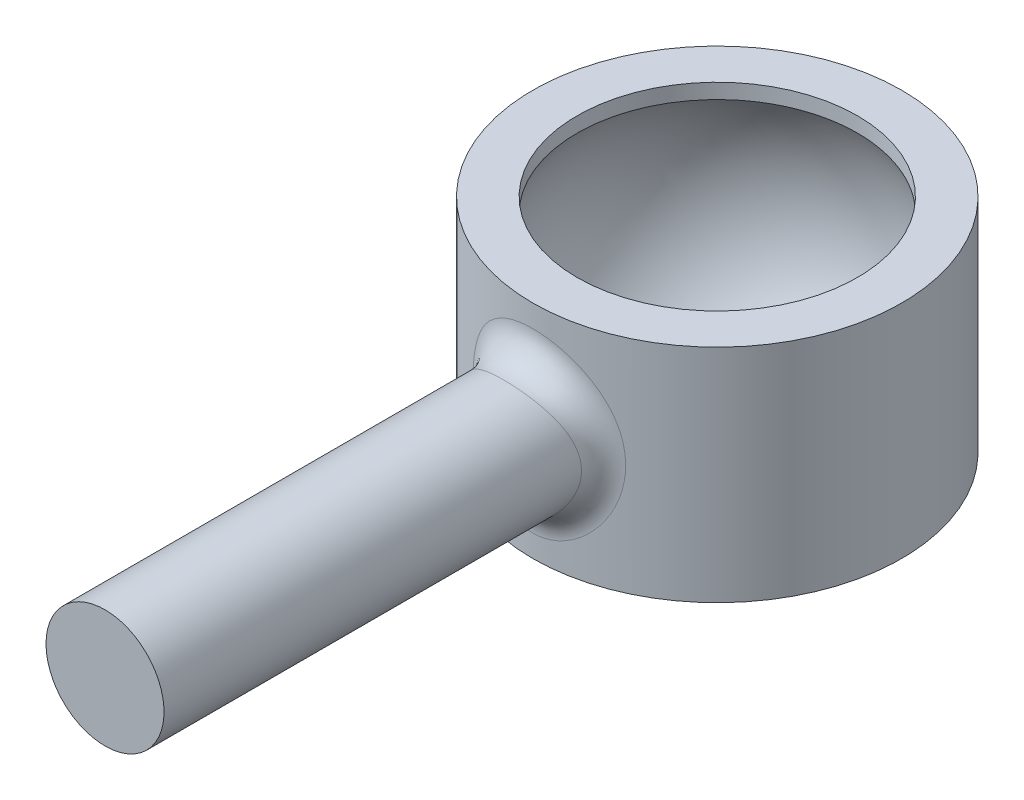
ISO-10303-21;
HEADER;
FILE_DESCRIPTION(('STEP AP214'),'2;1');
FILE_NAME('part.step','',(''),(''),'','','');
FILE_SCHEMA(('AUTOMOTIVE_DESIGN { 1 0 10303 214 1 1 1 1 }'));
ENDSEC;
DATA;
#1=APPLICATION_CONTEXT('core data for automotive mechanical design processes');
#2=APPLICATION_PROTOCOL_DEFINITION('international standard','automotive_design',2000,#1);
#3=PRODUCT_CONTEXT('',#1,'mechanical');
#4=PRODUCT('Part','Part','',(#3));
#5=PRODUCT_RELATED_PRODUCT_CATEGORY('part','',(#4));
#6=PRODUCT_DEFINITION_FORMATION('','',#4);
#7=PRODUCT_DEFINITION_CONTEXT('part definition',#1,'design');
#8=PRODUCT_DEFINITION('design','',#6,#7);
#9=PRODUCT_DEFINITION_SHAPE('','',#8);
#10=(LENGTH_UNIT() NAMED_UNIT(*) SI_UNIT(.MILLI.,.METRE.));
#11=(NAMED_UNIT(*) PLANE_ANGLE_UNIT() SI_UNIT($,.RADIAN.));
#12=(NAMED_UNIT(*) SI_UNIT($,.STERADIAN.) SOLID_ANGLE_UNIT());
#13=UNCERTAINTY_MEASURE_WITH_UNIT(LENGTH_MEASURE(1.E-05),#10,'distance_accuracy_value','');
#14=(GEOMETRIC_REPRESENTATION_CONTEXT(3) GLOBAL_UNCERTAINTY_ASSIGNED_CONTEXT((#13)) GLOBAL_UNIT_ASSIGNED_CONTEXT((#10,
#11,#12)) REPRESENTATION_CONTEXT('',''));
#15=CARTESIAN_POINT('',(0.,0.,0.));
#16=DIRECTION('',(0.,0.,1.));
#17=DIRECTION('',(1.,0.,0.));
#18=AXIS2_PLACEMENT_3D('',#15,#16,#17);
#19=CARTESIAN_POINT('',(0.,7.5,0.));
#20=DIRECTION('',(0.,-1.,0.));
#21=DIRECTION('',(0.,0.,-1.));
#22=AXIS2_PLACEMENT_3D('',#19,#20,#21);
#23=CYLINDRICAL_SURFACE('',#22,9.5);
#24=CARTESIAN_POINT('',(0.,-7.5,0.));
#25=DIRECTION('',(0.,1.,0.));
#26=DIRECTION('',(0.,0.,1.));
#27=AXIS2_PLACEMENT_3D('',#24,#25,#26);
#28=CIRCLE('',#27,9.5);
#29=CARTESIAN_POINT('',(0.,-7.5,9.5));
#30=VERTEX_POINT('',#29);
#31=EDGE_CURVE('E76',#30,#30,#28,.T.);
#32=ORIENTED_EDGE('',*,*,#31,.F.);
#33=EDGE_LOOP('',(#32));
#34=FACE_BOUND('',#33,.T.);
#35=CARTESIAN_POINT('',(0.,-6.48074069840786,0.));
#36=DIRECTION('',(0.,1.,0.));
#37=DIRECTION('',(0.,0.,1.));
#38=AXIS2_PLACEMENT_3D('',#35,#36,#37);
#39=CIRCLE('',#38,9.5);
#40=CARTESIAN_POINT('',(0.,-6.48074069840786,9.5));
#41=VERTEX_POINT('',#40);
#42=EDGE_CURVE('E65',#41,#41,#39,.T.);
#43=ORIENTED_EDGE('',*,*,#42,.T.);
#44=EDGE_LOOP('',(#43));
#45=FACE_BOUND('',#44,.T.);
#46=ADVANCED_FACE('F41',(#34,#45),#23,.F.);
#47=CARTESIAN_POINT('',(0.,7.5,0.));
#48=DIRECTION('',(0.,1.,0.));
#49=DIRECTION('',(0.,0.,1.));
#50=AXIS2_PLACEMENT_3D('',#47,#48,#49);
#51=CIRCLE('',#50,9.5);
#52=CARTESIAN_POINT('',(0.,7.5,9.5));
#53=VERTEX_POINT('',#52);
#54=EDGE_CURVE('E135',#53,#53,#51,.T.);
#55=ORIENTED_EDGE('',*,*,#54,.T.);
#56=EDGE_LOOP('',(#55));
#57=FACE_BOUND('',#56,.T.);
#58=CARTESIAN_POINT('',(0.,6.48074069840786,0.));
#59=DIRECTION('',(0.,-1.,0.));
#60=DIRECTION('',(0.,0.,-1.));
#61=AXIS2_PLACEMENT_3D('',#58,#59,#60);
#62=CIRCLE('',#61,9.5);
#63=CARTESIAN_POINT('',(0.,6.48074069840786,-9.5));
#64=VERTEX_POINT('',#63);
#65=EDGE_CURVE('E68',#64,#64,#62,.T.);
#66=ORIENTED_EDGE('',*,*,#65,.T.);
#67=EDGE_LOOP('',(#66));
#68=FACE_BOUND('',#67,.T.);
#69=ADVANCED_FACE('F117',(#57,#68),#23,.F.);
#70=CARTESIAN_POINT('',(0.,7.5,0.));
#71=DIRECTION('',(0.,1.,0.));
#72=DIRECTION('',(0.,0.,1.));
#73=AXIS2_PLACEMENT_3D('',#70,#71,#72);
#74=PLANE('',#73);
#75=CARTESIAN_POINT('',(0.,7.5,0.));
#76=DIRECTION('',(0.,1.,0.));
#77=DIRECTION('',(0.,0.,1.));
#78=AXIS2_PLACEMENT_3D('',#75,#76,#77);
#79=CIRCLE('',#78,12.5);
#80=CARTESIAN_POINT('',(0.,7.5,12.5));
#81=VERTEX_POINT('',#80);
#82=EDGE_CURVE('E91',#81,#81,#79,.T.);
#83=ORIENTED_EDGE('',*,*,#82,.T.);
#84=EDGE_LOOP('',(#83));
#85=FACE_BOUND('',#84,.T.);
#86=ORIENTED_EDGE('',*,*,#54,.F.);
#87=EDGE_LOOP('',(#86));
#88=FACE_BOUND('',#87,.T.);
#89=ADVANCED_FACE('F119',(#85,#88),#74,.T.);
#90=CARTESIAN_POINT('',(0.,-7.5,0.));
#91=DIRECTION('',(0.,1.,0.));
#92=DIRECTION('',(0.,0.,1.));
#93=AXIS2_PLACEMENT_3D('',#90,#91,#92);
#94=PLANE('',#93);
#95=CARTESIAN_POINT('',(0.,-7.5,0.));
#96=DIRECTION('',(0.,1.,0.));
#97=DIRECTION('',(0.,0.,1.));
#98=AXIS2_PLACEMENT_3D('',#95,#96,#97);
#99=CIRCLE('',#98,12.5);
#100=CARTESIAN_POINT('',(0.,-7.5,12.5));
#101=VERTEX_POINT('',#100);
#102=EDGE_CURVE('E81',#101,#101,#99,.T.);
#103=ORIENTED_EDGE('',*,*,#102,.F.);
#104=EDGE_LOOP('',(#103));
#105=FACE_BOUND('',#104,.T.);
#106=ORIENTED_EDGE('',*,*,#31,.T.);
#107=EDGE_LOOP('',(#106));
#108=FACE_BOUND('',#107,.T.);
#109=ADVANCED_FACE('F121',(#105,#108),#94,.F.);
#110=CARTESIAN_POINT('',(0.,7.5,0.));
#111=DIRECTION('',(0.,-1.,0.));
#112=DIRECTION('',(0.,0.,-1.));
#113=AXIS2_PLACEMENT_3D('',#110,#111,#112);
#114=CYLINDRICAL_SURFACE('',#113,12.5);
#115=CARTESIAN_POINT('',(-4.8444617396471,-2.10246756780817,11.5230720926798));
#116=CARTESIAN_POINT('',(-3.67655555550449,-1.58828516226779,12.0140762952978));
#117=CARTESIAN_POINT('',(-3.74638374532709,-1.40164504520545,13.3667636275085));
#118=CARTESIAN_POINT('',(-4.89588966424905,-1.94304139882157,11.5014487929514));
#119=CARTESIAN_POINT('',(-3.72643444385713,-1.47110445109973,11.9992249647614));
#120=CARTESIAN_POINT('',(-3.78615467369302,-1.2953609325479,13.3416805998469));
#121=CARTESIAN_POINT('',(-4.94153536915947,-1.78082317981735,11.4818588236582));
#122=CARTESIAN_POINT('',(-3.77121315212646,-1.35040041039213,11.9855202201527));
#123=CARTESIAN_POINT('',(-3.82145401884073,-1.18721545321133,13.3189562355296));
#124=CARTESIAN_POINT('',(-5.02085509957196,-1.45186060196325,11.4473970764669));
#125=CARTESIAN_POINT('',(-3.84926712015815,-1.10410948132719,11.9612364841778));
#126=CARTESIAN_POINT('',(-3.88279461035614,-0.967907067975126,13.2789806087769));
#127=CARTESIAN_POINT('',(-5.05453463417908,-1.28511836408435,11.4325231277005));
#128=CARTESIAN_POINT('',(-3.88264682151573,-0.978392967975752,11.9506271994491));
#129=CARTESIAN_POINT('',(-3.90884011709843,-0.856745576056137,13.2617268281342));
#130=CARTESIAN_POINT('',(-5.10951302206407,-0.948474520910453,11.4080577589927));
#131=CARTESIAN_POINT('',(-3.93720589949724,-0.723579198653547,11.9331088828782));
#132=CARTESIAN_POINT('',(-3.95135673706294,-0.632316347273731,13.2333470004299));
#133=CARTESIAN_POINT('',(-5.13081709829659,-0.778574279712781,11.3984641106362));
#134=CARTESIAN_POINT('',(-3.9584647404587,-0.594322033670963,11.9261750957423));
#135=CARTESIAN_POINT('',(-3.96783188937008,-0.519049519808528,13.2222183684068));
#136=CARTESIAN_POINT('',(-5.16079949156891,-0.436984929917426,11.3849207995746));
#137=CARTESIAN_POINT('',(-3.98837301799551,-0.333998965288748,11.9163804849995));
#138=CARTESIAN_POINT('',(-3.99101827350046,-0.291323286611572,13.2065081275758));
#139=CARTESIAN_POINT('',(-5.16947881311368,-0.265295964736806,11.3809706878347));
#140=CARTESIAN_POINT('',(-3.9970659262657,-0.202752142932899,11.9135055248696));
#141=CARTESIAN_POINT('',(-3.99773028214088,-0.176863976491194,13.2019259978873));
#142=CARTESIAN_POINT('',(-5.17390128124342,0.0640464153638656,11.3789609471823));
#143=CARTESIAN_POINT('',(-4.00148654978303,0.048924086281851,11.9120462630168));
#144=CARTESIAN_POINT('',(-4.00115032416191,0.0426976102425678,13.1995946987323));
#145=CARTESIAN_POINT('',(-5.17066138767355,0.221678166012125,11.3804382319878));
#146=CARTESIAN_POINT('',(-3.99823918051652,0.169494431859367,11.9131227685163));
#147=CARTESIAN_POINT('',(-3.99864480648607,0.147785444008086,13.2013083491672));
#148=CARTESIAN_POINT('',(-5.15352432676526,0.536013324879269,11.3882066402324));
#149=CARTESIAN_POINT('',(-3.98112590514028,0.409461886293225,11.9187535916601));
#150=CARTESIAN_POINT('',(-3.98539214605422,0.357342216586168,13.2103197027442));
#151=CARTESIAN_POINT('',(-5.13962365019902,0.692716410288187,11.3944993487711));
#152=CARTESIAN_POINT('',(-3.96723589591816,0.529001876951715,11.9233158191695));
#153=CARTESIAN_POINT('',(-3.97464228949536,0.461810940192087,13.2176192446019));
#154=CARTESIAN_POINT('',(-5.08210779809834,1.15958449052567,11.4203387551509));
#155=CARTESIAN_POINT('',(-3.90989407305108,0.884204969593816,11.9419587102405));
#156=CARTESIAN_POINT('',(-3.9301633638465,0.773056327017192,13.2475929559203));
#157=CARTESIAN_POINT('',(-5.02268277431515,1.46683503414461,11.4468453389273));
#158=CARTESIAN_POINT('',(-3.85060816880218,1.11674043011683,11.9610473572464));
#159=CARTESIAN_POINT('',(-3.88420801212931,0.977890022763482,13.2783405931253));
#160=CARTESIAN_POINT('',(-4.8650434974271,2.0608493874306,11.5147067440569));
#161=CARTESIAN_POINT('',(-3.69600976847763,1.55956658784528,12.0085517351442));
#162=CARTESIAN_POINT('',(-3.76230030468461,1.37389959162,13.3570598231359));
#163=CARTESIAN_POINT('',(-4.76730736958892,2.3478161264146,11.5558779919603));
#164=CARTESIAN_POINT('',(-3.60050142677028,1.7708474469564,12.0370336084846));
#165=CARTESIAN_POINT('',(-3.68671769916335,1.56521075094153,13.4048184707395));
#166=CARTESIAN_POINT('',(-4.53615608640504,2.89931222468328,11.6485519234938));
#167=CARTESIAN_POINT('',(-3.37956016434596,2.16829575244232,12.0987616556204));
#168=CARTESIAN_POINT('',(-3.5079607068306,1.93287481645467,13.5123202313001));
#169=CARTESIAN_POINT('',(-4.40272931806019,3.16383424395173,11.7000579684884));
#170=CARTESIAN_POINT('',(-3.25338601971019,2.35477329455787,12.1321683029419));
#171=CARTESIAN_POINT('',(-3.40477733929975,2.10922282930211,13.57206724344));
#172=CARTESIAN_POINT('',(-4.09185543979247,3.6848736798094,11.8125380754076));
#173=CARTESIAN_POINT('',(-2.96733937644181,2.71189804052598,12.2016512720828));
#174=CARTESIAN_POINT('',(-3.16436820677299,2.45658245320523,13.7025441674799));
#175=CARTESIAN_POINT('',(-3.91179122442272,3.9391673688777,11.8739369870591));
#176=CARTESIAN_POINT('',(-2.80501020893834,2.8798360467687,12.2377740711856));
#177=CARTESIAN_POINT('',(-3.02511854689992,2.62611157924651,13.773766905073));
#178=CARTESIAN_POINT('',(-3.51823431567901,4.41042998092296,11.9964362914211));
#179=CARTESIAN_POINT('',(-2.46339302930432,3.17894306043859,12.3050741251929));
#180=CARTESIAN_POINT('',(-2.72076787080771,2.940286653951,13.9158660981182));
#181=CARTESIAN_POINT('',(-3.30472869700226,4.62738440371583,12.0575365592485));
#182=CARTESIAN_POINT('',(-2.2836503187012,3.30950906436195,12.3361802410523));
#183=CARTESIAN_POINT('',(-2.55565685902106,3.08492293582482,13.9867424087057));
#184=CARTESIAN_POINT('',(-2.8374071669797,5.02851439100907,12.1762063446435));
#185=CARTESIAN_POINT('',(-1.90731725256935,3.53973434335117,12.3917060367257));
#186=CARTESIAN_POINT('',(-2.19426154245802,3.35234292732441,14.12439935981));
#187=CARTESIAN_POINT('',(-2.58211144470143,5.21051419079988,12.2334475585459));
#188=CARTESIAN_POINT('',(-1.71062319070473,3.63645130421255,12.415472074792));
#189=CARTESIAN_POINT('',(-1.99683285056091,3.47367612714113,14.1907991680869));
#190=CARTESIAN_POINT('',(-2.04609983761598,5.52153086270848,12.3344107209253));
#191=CARTESIAN_POINT('',(-1.31806282447388,3.7932656162215,12.4533933461624));
#192=CARTESIAN_POINT('',(-1.58231720775045,3.68102057508425,14.3079164364395));
#193=CARTESIAN_POINT('',(-1.76539371321657,5.65056797384705,12.3781378320646));
#194=CARTESIAN_POINT('',(-1.1230114747396,3.85239807252975,12.4673019379735));
#195=CARTESIAN_POINT('',(-1.36523780488575,3.76704531589114,14.3586398852036));
#196=CARTESIAN_POINT('',(-1.19972728873295,5.8459449752532,12.4454040195341));
#197=CARTESIAN_POINT('',(-0.746534782599482,3.93847221620453,12.4869428195147));
#198=CARTESIAN_POINT('',(-0.92778910328847,3.89729665017539,14.4366686626513));
#199=CARTESIAN_POINT('',(-0.915521727427312,5.91483604529956,12.4697601799573));
#200=CARTESIAN_POINT('',(-0.565986526940683,3.96615063193291,12.4928700022144));
#201=CARTESIAN_POINT('',(-0.708003469211529,3.94322403017553,14.4649218088696));
#202=CARTESIAN_POINT('',(-0.340230205745712,5.99642358929904,12.4986816456494));
#203=CARTESIAN_POINT('',(-0.207373350389595,3.99884232722993,12.4998022248714));
#204=CARTESIAN_POINT('',(-0.26311135911082,3.99761572617127,14.4984707090808));
#205=CARTESIAN_POINT('',(-0.0491473474128014,6.0091449301745,12.5032557086399));
#206=CARTESIAN_POINT('',(-0.0306789154186671,4.00361572000886,12.5007558027705));
#207=CARTESIAN_POINT('',(-0.0380072820003434,4.00609662011508,14.5037766220308));
#208=CARTESIAN_POINT('',(0.511687069629945,5.97887283724624,12.4924716080788));
#209=CARTESIAN_POINT('',(0.314216186693455,3.99170751292352,12.4982753012294));
#210=CARTESIAN_POINT('',(0.39570466718153,3.985915224832,14.4912670653634));
#211=CARTESIAN_POINT('',(0.781610758850107,5.9393957473265,12.4783713392138));
#212=CARTESIAN_POINT('',(0.481026357079951,3.97645948932534,12.4951346487874));
#213=CARTESIAN_POINT('',(0.60444565351407,3.95959716486427,14.4749107535688));
#214=CARTESIAN_POINT('',(1.31149473103413,5.81240430639145,12.4338527568092));
#215=CARTESIAN_POINT('',(0.820374812775093,3.92355089450872,12.4835365070087));
#216=CARTESIAN_POINT('',(1.01422259199456,3.87493620423893,14.4232691979401));
#217=CARTESIAN_POINT('',(1.57145448386155,5.72488740317789,12.4034335763011));
#218=CARTESIAN_POINT('',(0.991850353306681,3.8862345782064,12.4751578323628));
#219=CARTESIAN_POINT('',(1.21525813417032,3.81659160211583,14.3879829484226));
#220=CARTESIAN_POINT('',(2.07665502398278,5.5041738013331,12.3289601972483));
#221=CARTESIAN_POINT('',(1.34089715303431,3.78369059052376,12.4510704528171));
#222=CARTESIAN_POINT('',(1.60594655189608,3.66944920089152,14.3015938288952));
#223=CARTESIAN_POINT('',(2.32176979877187,5.3706370520089,12.2848047416771));
#224=CARTESIAN_POINT('',(1.51767880660002,3.71885105707469,12.4354575464715));
#225=CARTESIAN_POINT('',(1.79550197777615,3.58042470132808,14.2503735007379));
#226=CARTESIAN_POINT('',(2.78970317786119,5.06216213788037,12.1870738957653));
#227=CARTESIAN_POINT('',(1.87078181927688,3.55679807522166,12.396020689279));
#228=CARTESIAN_POINT('',(2.15737045753835,3.37477475858162,14.1370057191332));
#229=CARTESIAN_POINT('',(3.01251661656411,4.88721441259638,12.1334963308942));
#230=CARTESIAN_POINT('',(2.04666190489165,3.46031784410498,12.372380589476));
#231=CARTESIAN_POINT('',(2.32967951669185,3.2581429417455,14.0748557432301));
#232=CARTESIAN_POINT('',(3.44565350523655,4.48712309259565,12.0179478500749));
#233=CARTESIAN_POINT('',(2.40133460794367,3.22537919190201,12.3162278686789));
#234=CARTESIAN_POINT('',(2.66463871084196,2.99141539504821,13.9408195067351));
#235=CARTESIAN_POINT('',(3.65411191424346,4.25938416156846,11.9556543125964));
#236=CARTESIAN_POINT('',(2.57978234428279,3.08518129854287,12.2833565303091));
#237=CARTESIAN_POINT('',(2.82584654752603,2.83958944097526,13.8685590053443));
#238=CARTESIAN_POINT('',(4.03618854743362,3.766838230884,11.832142537355));
#239=CARTESIAN_POINT('',(2.91626454457169,2.76651829957658,12.2134558578243));
#240=CARTESIAN_POINT('',(3.12131914387059,2.51122548718365,13.7252853461285));
#241=CARTESIAN_POINT('',(4.2097731354255,3.50199585836505,11.7709253892048));
#242=CARTESIAN_POINT('',(3.07484982935293,2.58852436126233,12.1764568603379));
#243=CARTESIAN_POINT('',(3.25555789154236,2.33466390555731,13.6542734522502));
#244=CARTESIAN_POINT('',(4.52393372490858,2.92925386536928,11.6538994444324));
#245=CARTESIAN_POINT('',(3.36687059285093,2.19050412785084,12.1026244017297));
#246=CARTESIAN_POINT('',(3.49850874711001,1.95283591026637,13.5185233547374));
#247=CARTESIAN_POINT('',(4.66287409904039,2.6200384122166,11.5984131956832));
#248=CARTESIAN_POINT('',(3.50009145367924,1.96892378616247,12.0656953417809));
#249=CARTESIAN_POINT('',(3.60595596986699,1.74669227481507,13.4541593067397));
#250=CARTESIAN_POINT('',(4.83537957565768,2.13753012350056,11.5270520743828));
#251=CARTESIAN_POINT('',(3.66741272594295,1.61488711297604,12.0169495108023));
#252=CARTESIAN_POINT('',(3.73936020520401,1.42502008233171,13.3713804064103));
#253=CARTESIAN_POINT('',(4.88686663496422,1.9737374154129,11.5052575331239));
#254=CARTESIAN_POINT('',(3.71767563298851,1.49380848976074,12.0018467021475));
#255=CARTESIAN_POINT('',(3.77917686442047,1.31582494360763,13.3460987386018));
#256=CARTESIAN_POINT('',(4.97748582853542,1.64092539429731,11.4663455988418));
#257=CARTESIAN_POINT('',(3.80647842638166,1.24598925022297,11.9746454277785));
#258=CARTESIAN_POINT('',(3.84925570740041,1.09395026286503,13.3009608946545));
#259=CARTESIAN_POINT('',(5.01662695251936,1.47190998311329,11.449224803848));
#260=CARTESIAN_POINT('',(3.84514092662865,1.11912604090943,11.9625127601212));
#261=CARTESIAN_POINT('',(3.87952484321354,0.981273322075783,13.2811007722301));
#262=CARTESIAN_POINT('',(5.06371728625239,1.22599852826439,11.428429784732));
#263=CARTESIAN_POINT('',(3.89179588066064,0.933455741795291,11.9476832128311));
#264=CARTESIAN_POINT('',(3.91594136806507,0.81733235217615,13.2569785503916));
#265=CARTESIAN_POINT('',(5.07684504569838,1.15062832912794,11.422601023883));
#266=CARTESIAN_POINT('',(3.90481661153259,0.876466149326562,11.9435145345919));
#267=CARTESIAN_POINT('',(3.9260935020927,0.767085552751666,13.2502171879989));
#268=CARTESIAN_POINT('',(5.1006093575682,0.999249356101543,11.4120091516658));
#269=CARTESIAN_POINT('',(3.92841272972126,0.761799439428116,11.9359218466566));
#270=CARTESIAN_POINT('',(3.94447123660452,0.666166237400741,13.2379306162241));
#271=CARTESIAN_POINT('',(5.11124556242925,0.923240494650628,11.4072461889765));
#272=CARTESIAN_POINT('',(3.93899426587536,0.704107460325652,11.9324959088087));
#273=CARTESIAN_POINT('',(3.95269656830683,0.61549366310032,13.2324055793097));
#274=CARTESIAN_POINT('',(5.13962453053764,0.692352064374446,11.394503564438));
#275=CARTESIAN_POINT('',(3.96722826569816,0.528712686091111,11.9233220093033));
#276=CARTESIAN_POINT('',(3.97464297022526,0.461568042916497,13.2176241345516));
#277=CARTESIAN_POINT('',(5.15344386007244,0.536659664375909,11.3882455713027));
#278=CARTESIAN_POINT('',(3.98104096632073,0.409951818987864,11.918783717098));
#279=CARTESIAN_POINT('',(3.98532991845958,0.357773109583966,13.2103648627209));
#280=CARTESIAN_POINT('',(5.1705623523953,0.224315856960713,11.3804806928271));
#281=CARTESIAN_POINT('',(3.99814483580714,0.171510699075373,11.9131516527978));
#282=CARTESIAN_POINT('',(3.99856821922431,0.149543904640442,13.2013576038095));
#283=CARTESIAN_POINT('',(5.17385600018629,0.0676639898766685,11.3789762981692));
#284=CARTESIAN_POINT('',(4.00145084305738,0.0516891589601707,11.9120530035479));
#285=CARTESIAN_POINT('',(4.0011153068236,0.0451093265845241,13.1996125059202));
#286=CARTESIAN_POINT('',(5.16782023123979,-0.40247866947219,11.3817348687424));
#287=CARTESIAN_POINT('',(3.99538835897784,-0.307620268566591,11.9140693978142));
#288=CARTESIAN_POINT('',(3.99644764546633,-0.268319112981617,13.2028124476532));
#289=CARTESIAN_POINT('',(5.14253898255892,-0.715870043403277,11.3932856327302));
#290=CARTESIAN_POINT('',(3.96995683892509,-0.547518493281993,11.922524217812));
#291=CARTESIAN_POINT('',(3.97689681317893,-0.477246695603263,13.2162113339595));
#292=CARTESIAN_POINT('',(5.05057021165367,-1.33177895527746,11.4343407351272));
#293=CARTESIAN_POINT('',(3.87860092052381,-1.01440911993568,11.951973997152));
#294=CARTESIAN_POINT('',(3.90577429701214,-0.887852636850561,13.263835252755));
#295=CARTESIAN_POINT('',(4.9839876779888,-1.63432201343773,11.4637995471936));
#296=CARTESIAN_POINT('',(3.81235842784661,-1.24244534040517,11.9730701399541));
#297=CARTESIAN_POINT('',(3.8542838042856,-1.08954800895435,13.2980074746867));
#298=CARTESIAN_POINT('',(4.85524100223429,-2.07455292598536,11.5186260201111));
#299=CARTESIAN_POINT('',(3.68687162983072,-1.56823548469057,12.0110850893043));
#300=CARTESIAN_POINT('',(3.75471970841016,-1.38303528398787,13.3616061834136));
#301=CARTESIAN_POINT('',(4.80750430523681,-2.21905253211387,11.5386782231387));
#302=CARTESIAN_POINT('',(3.64041018549735,-1.67464669920156,12.0248993095021));
#303=CARTESIAN_POINT('',(3.71780332942589,-1.47936835474187,13.3848667390133));
#304=CARTESIAN_POINT('',(4.7027444001081,-2.50296358003793,11.581770941702));
#305=CARTESIAN_POINT('',(3.53932725568588,-1.88178886841221,12.0541353516127));
#306=CARTESIAN_POINT('',(3.6367890027631,-1.66864238669261,13.4348542924052));
#307=CARTESIAN_POINT('',(4.64571402903485,-2.64237099484833,11.6048137593922));
#308=CARTESIAN_POINT('',(3.48460879789867,-1.98257234177167,12.0695803096241));
#309=CARTESIAN_POINT('',(3.59268551574267,-1.76158066323259,13.4615839606965));
#310=CARTESIAN_POINT('',(4.45695391886639,-3.06136358932451,11.6792247957642));
#311=CARTESIAN_POINT('',(3.30468094581452,-2.28306761157391,12.1187077022642));
#312=CARTESIAN_POINT('',(3.44671103068167,-2.0409090595489,13.5479007634974));
#313=CARTESIAN_POINT('',(4.3105863170689,-3.33134348990973,11.7345210720376));
#314=CARTESIAN_POINT('',(3.16737174529173,-2.47126491263851,12.1539905640432));
#315=CARTESIAN_POINT('',(3.33352008581773,-2.22089565993786,13.6120444462189));
#316=CARTESIAN_POINT('',(3.98353673552133,-3.84032595909387,11.849531224315));
#317=CARTESIAN_POINT('',(2.86988567991999,-2.81497320389732,12.223473123504));
#318=CARTESIAN_POINT('',(3.0806017427629,-2.56021730605957,13.7454562228853));
#319=CARTESIAN_POINT('',(3.80284221112691,-4.07931714909496,11.9092467104172));
#320=CARTESIAN_POINT('',(2.70902250192381,-2.97025838644821,12.2577223930566));
#321=CARTESIAN_POINT('',(2.94086464338001,-2.71954476606044,13.8147261845424));
#322=CARTESIAN_POINT('',(3.50152790164426,-4.41941188802404,12.0000615054046));
#323=CARTESIAN_POINT('',(2.45172918198305,-3.18174156623264,12.3061718177829));
#324=CARTESIAN_POINT('',(2.70784824387971,-2.94627459201757,13.9200713460222));
#325=CARTESIAN_POINT('',(3.39160055349846,-4.53330220719859,12.031665673374));
#326=CARTESIAN_POINT('',(2.35911911079826,-3.2509699896476,12.3224277639034));
#327=CARTESIAN_POINT('',(2.62283776137409,-3.02220147146961,13.956732181132));
#328=CARTESIAN_POINT('',(3.16367947464965,-4.74986996131057,12.0935970965356));
#329=CARTESIAN_POINT('',(2.1711155648183,-3.379344566709,12.3529755394263));
#330=CARTESIAN_POINT('',(2.4465787937626,-3.16657997420303,14.0285726321597));
#331=CARTESIAN_POINT('',(3.0456932937151,-4.85255766314566,12.1239255049921));
#332=CARTESIAN_POINT('',(2.07571183169328,-3.43838910636307,12.3672471323865));
#333=CARTESIAN_POINT('',(2.35533614714441,-3.23503844208287,14.0637535858645));
#334=CARTESIAN_POINT('',(2.68037942408551,-5.1429255126996,12.2117995832443));
#335=CARTESIAN_POINT('',(1.78579272904947,-3.60152092705798,12.4068223381524));
#336=CARTESIAN_POINT('',(2.07282675458684,-3.42861700844933,14.1656875164246));
#337=CARTESIAN_POINT('',(2.4216005537528,-5.31301864631241,12.2662641715017));
#338=CARTESIAN_POINT('',(1.59048432712597,-3.68935568449337,12.4283463264391));
#339=CARTESIAN_POINT('',(1.87270442822336,-3.54201243089305,14.2288664387968));
#340=CARTESIAN_POINT('',(1.88300889916712,-5.59874079151319,12.3603544174517));
#341=CARTESIAN_POINT('',(1.20377205365691,-3.82950060596839,12.4619903387982));
#342=CARTESIAN_POINT('',(1.45619354870127,-3.73249386099084,14.3380111243878));
#343=CARTESIAN_POINT('',(1.60340389440598,-5.71484122075643,12.4001078706416));
#344=CARTESIAN_POINT('',(1.01322216386686,-3.88123422643563,12.4739650980062));
#345=CARTESIAN_POINT('',(1.23996567834996,-3.80989414708269,14.3841251303806));
#346=CARTESIAN_POINT('',(1.02927551837204,-5.89005625698913,12.4608856608507));
#347=CARTESIAN_POINT('',(0.636910666274281,-3.95675781546869,12.4909460585065));
#348=CARTESIAN_POINT('',(0.795973067544849,-3.92670417123628,14.4546273670003));
#349=CARTESIAN_POINT('',(0.734760950529829,-5.94920408822933,12.4819209168993));
#350=CARTESIAN_POINT('',(0.452478126191081,-3.97998711448592,12.4958187283674));
#351=CARTESIAN_POINT('',(0.568215135077384,-3.96613605879842,14.4790282637018));
#352=CARTESIAN_POINT('',(0.161653525133381,-6.00568249406691,12.5020112166047));
#353=CARTESIAN_POINT('',(0.0981551740884992,-4.00231733803188,12.5004977725935));
#354=CARTESIAN_POINT('',(0.125012059435569,-4.00378832939758,14.5023330111698));
#355=CARTESIAN_POINT('',(-0.116595610892148,-6.00708219379687,12.5025130882864));
#356=CARTESIAN_POINT('',(-0.0706294092909622,-4.00284879258892,12.5006045748879));
#357=CARTESIAN_POINT('',(-0.0901672724234951,-4.00472146252946,14.5029151824158));
#358=CARTESIAN_POINT('',(-0.66909268193111,-5.95825745580712,12.4851377399653));
#359=CARTESIAN_POINT('',(-0.411711019676216,-3.98357400484393,12.4965732317603));
#360=CARTESIAN_POINT('',(-0.517431674026615,-3.97217163719456,14.4827597784055));
#361=CARTESIAN_POINT('',(-0.943341077925085,-5.90803901414463,12.4672626546633));
#362=CARTESIAN_POINT('',(-0.582793475719667,-3.96390582177705,12.4924639315757));
#363=CARTESIAN_POINT('',(-0.729517100262291,-3.93869267609925,14.4620246794021));
#364=CARTESIAN_POINT('',(-1.47282412086001,-5.76006490519729,12.4157072182518));
#365=CARTESIAN_POINT('',(-0.926609633530677,-3.90099218222902,12.4784592622184));
#366=CARTESIAN_POINT('',(-1.13898398679819,-3.84004327012877,14.4022203731792));
#367=CARTESIAN_POINT('',(-1.72836839981953,-5.66358624429705,12.3824522538771));
#368=CARTESIAN_POINT('',(-1.09811560188473,-3.85878279173722,12.4688132690969));
#369=CARTESIAN_POINT('',(-1.33660489585947,-3.77572416284416,14.3636446145689));
#370=CARTESIAN_POINT('',(-2.2219054261079,-5.42705688797298,12.3034817314396));
#371=CARTESIAN_POINT('',(-1.44513655834668,-3.74614920958654,12.442069437047));
#372=CARTESIAN_POINT('',(-1.71827352952307,-3.61803792529429,14.2720388085468));
#373=CARTESIAN_POINT('',(-2.45989455560909,-5.28699724208667,12.2577636139909));
#374=CARTESIAN_POINT('',(-1.6199069023458,-3.67633823052981,12.4251275875539));
#375=CARTESIAN_POINT('',(-1.90231845633867,-3.52466482805405,14.2190057922474));
#376=CARTESIAN_POINT('',(-2.92496190879413,-4.95909090483818,12.1554186211797));
#377=CARTESIAN_POINT('',(-1.97647799975401,-3.50024390222917,12.3822280444602));
#378=CARTESIAN_POINT('',(-2.26197054279977,-3.30606060322938,14.1002856005496));
#379=CARTESIAN_POINT('',(-3.15084581967371,-4.76915352931797,12.0983509917048));
#380=CARTESIAN_POINT('',(-2.15795322801003,-3.39300070223022,12.35603208153));
#381=CARTESIAN_POINT('',(-2.43665410054306,-3.17943568620483,14.0340871503851));
#382=CARTESIAN_POINT('',(-3.57298255947385,-4.35036408817441,11.980480624687));
#383=CARTESIAN_POINT('',(-2.50965112458406,-3.14135532491725,12.296621828077));
#384=CARTESIAN_POINT('',(-2.76310651265203,-2.90024272543938,13.8973575246428));
#385=CARTESIAN_POINT('',(-3.76922099014786,-4.12149322728994,11.919676092241));
#386=CARTESIAN_POINT('',(-2.68001733331854,-2.99765844999439,12.2635426949046));
#387=CARTESIAN_POINT('',(-2.91486423237372,-2.74766215152443,13.8268242669772));
#388=CARTESIAN_POINT('',(-4.13930966754748,-3.6141428296818,11.7964637773726));
#389=CARTESIAN_POINT('',(-3.00948258337324,-2.66462292771854,12.1922166971946));
#390=CARTESIAN_POINT('',(-3.20106614291114,-2.40942855312353,13.683897981776));
#391=CARTESIAN_POINT('',(-4.31094171752488,-3.33343372455755,11.7342000489982));
#392=CARTESIAN_POINT('',(-3.16805895138683,-2.47322162318573,12.1537373920604));
#393=CARTESIAN_POINT('',(-3.3337949282425,-2.22228914970312,13.6116720569426));
#394=CARTESIAN_POINT('',(-4.61118222069506,-2.73982404708635,11.6195085298602));
#395=CARTESIAN_POINT('',(-3.4498915317925,-2.05539134510654,12.0799960994884));
#396=CARTESIAN_POINT('',(-3.56598091734968,-1.82654936472096,13.4786298947069));
#397=CARTESIAN_POINT('',(-4.73979680140395,-2.42692806782784,11.5670793387081));
#398=CARTESIAN_POINT('',(-3.57416693407575,-1.82882724070611,12.0445622846658));
#399=CARTESIAN_POINT('',(-3.66544285973797,-1.61795204521819,13.417812032854));
#400=CARTESIAN_POINT('',(-4.8444617396471,-2.10246756780817,11.5230720926798));
#401=CARTESIAN_POINT('',(-3.67655555550449,-1.58828516226779,12.0140762952978));
#402=CARTESIAN_POINT('',(-3.74638374532709,-1.40164504520545,13.3667636275085));
#403=(BOUNDED_SURFACE() B_SPLINE_SURFACE(3,2,((#115,#116,#117),(#118,#119,#120),(#121,#122,
#123),(#124,#125,#126),(#127,#128,#129),(#130,#131,#132),(#133,#134,#135),(#136,#137,#138),
(#139,#140,#141),(#142,#143,#144),(#145,#146,#147),(#148,#149,#150),(#151,#152,#153),(#154,#155,
#156),(#157,#158,#159),(#160,#161,#162),(#163,#164,#165),(#166,#167,#168),(#169,#170,#171),
(#172,#173,#174),(#175,#176,#177),(#178,#179,#180),(#181,#182,#183),(#184,#185,#186),(#187,#188,
#189),(#190,#191,#192),(#193,#194,#195),(#196,#197,#198),(#199,#200,#201),(#202,#203,#204),
(#205,#206,#207),(#208,#209,#210),(#211,#212,#213),(#214,#215,#216),(#217,#218,#219),(#220,#221,
#222),(#223,#224,#225),(#226,#227,#228),(#229,#230,#231),(#232,#233,#234),(#235,#236,#237),
(#238,#239,#240),(#241,#242,#243),(#244,#245,#246),(#247,#248,#249),(#250,#251,#252),(#253,#254,
#255),(#256,#257,#258),(#259,#260,#261),(#262,#263,#264),(#265,#266,#267),(#268,#269,#270),
(#271,#272,#273),(#274,#275,#276),(#277,#278,#279),(#280,#281,#282),(#283,#284,#285),(#286,#287,
#288),(#289,#290,#291),(#292,#293,#294),(#295,#296,#297),(#298,#299,#300),(#301,#302,#303),
(#304,#305,#306),(#307,#308,#309),(#310,#311,#312),(#313,#314,#315),(#316,#317,#318),(#319,#320,
#321),(#322,#323,#324),(#325,#326,#327),(#328,#329,#330),(#331,#332,#333),(#334,#335,#336),
(#337,#338,#339),(#340,#341,#342),(#343,#344,#345),(#346,#347,#348),(#349,#350,#351),(#352,#353,
#354),(#355,#356,#357),(#358,#359,#360),(#361,#362,#363),(#364,#365,#366),(#367,#368,#369),
(#370,#371,#372),(#373,#374,#375),(#376,#377,#378),(#379,#380,#381),(#382,#383,#384),(#385,#386,
#387),(#388,#389,#390),(#391,#392,#393),(#394,#395,#396),(#397,#398,#399),(#400,#401,#402)),
.UNSPECIFIED.,.T.,.F.,.F.) B_SPLINE_SURFACE_WITH_KNOTS((4,2,2,2,2,2,2,2,2,2,2,2,2,2,2,2,2,2,2,2,
2,2,2,2,2,2,2,2,2,2,2,2,2,2,2,2,2,2,2,2,2,2,2,2,2,2,2,4),(3,3),(0.,0.515861053057289,
1.03148430015754,1.5468897745463,2.06225423778691,2.53470672219436,3.00731479136398,
3.95156357368465,4.88438518119399,5.81751067962202,6.82323068411458,7.8293403690163,
8.88565272753184,9.94156105299377,10.9501372836612,11.9582669623607,12.9018259234637,
13.8454350176224,14.7961716985334,15.7471280888122,16.7624252098779,17.778696944115,
18.8364308670776,19.36433759993,19.8918590442054,20.1233754595532,20.3549241513886,
20.82432919146,21.2939801389609,22.2341403623796,23.1719204216257,23.6409461296011,
24.1103350559352,25.0819343327434,26.0538893622671,26.577905355757,27.1014369951327,
28.1480291809506,29.1853034397732,30.2219722200382,31.1854591471644,32.1488341665431,
33.0870252365075,34.0254091151614,35.0121513985961,35.999371393829,37.0493896648317,
38.0992583048397),(0.,1.),
.UNSPECIFIED.) GEOMETRIC_REPRESENTATION_ITEM() RATIONAL_B_SPLINE_SURFACE(((1.,0.82552536433639,
1.),(1.,0.827859613440203,1.),(1.,0.829957748189218,1.),(1.,0.833630942342483,1.),(1.,
0.83520624243252,1.),(1.,0.837789320652789,1.),(1.,0.838797338194077,1.),(1.,0.840218547295458,
1.),(1.,0.840631786179857,1.),(1.,0.840842158227326,1.),(1.,0.840687726589724,1.),(1.,
0.839873727976442,1.),(1.,0.839213994669859,1.),(1.,0.836496300831219,1.),(1.,0.833700010355136,
1.),(1.,0.826440283641101,1.),(1.,0.821997432513669,1.),(1.,0.811818431125445,1.),(1.,
0.806081860010318,1.),(1.,0.793299520931635,1.),(1.,0.786186621186942,1.),(1.,0.771671147831238,
1.),(1.,0.764268463049849,1.),(1.,0.749582795752253,1.),(1.,0.742324217261325,1.),(1.,
0.72929075452771,1.),(1.,0.723515303842937,1.),(1.,0.714535340610947,1.),(1.,0.711227188310441,
1.),(1.,0.707291331743392,1.),(1.,0.706662441344117,1.),(1.,0.708135081713291,1.),(1.,
0.710064308936803,1.),(1.,0.716077491108403,1.),(1.,0.720161560535767,1.),(1.,0.729983463606212,
1.),(1.,0.735733555999064,1.),(1.,0.748197037364627,1.),(1.,0.754910648642141,1.),(1.,
0.769077592402115,1.),(1.,0.776550240517707,1.),(1.,0.791045022962967,1.),(1.,0.798066717945604,
1.),(1.,0.811243727106379,1.),(1.,0.81735200675827,1.),(1.,0.825102426130964,1.),(1.,
0.827449070108281,1.),(1.,0.831615568950194,1.),(1.,0.833435807037695,1.),(1.,0.835638140329437,
1.),(1.,0.836254091497093,1.),(1.,0.837371654468842,1.),(1.,0.837873250320525,1.),(1.,
0.839213714366839,1.),(1.,0.83986974640793,1.),(1.,0.840683180424985,1.),(1.,0.840840321003352,
1.),(1.,0.840552255604477,1.),(1.,0.839345886750626,1.),(1.,0.835016461224253,1.),(1.,
0.831898264681795,1.),(1.,0.826008884680954,1.),(1.,0.823843342945611,1.),(1.,0.819153924865893,
1.),(1.,0.81662977232219,1.),(1.,0.808407728325314,1.),(1.,0.80220366857347,1.),(1.,
0.789020752231651,1.),(1.,0.782041612780266,1.),(1.,0.771196912842224,1.),(1.,0.767378754436288,
1.),(1.,0.759812933346232,1.),(1.,0.756065208764143,1.),(1.,0.745087485748383,1.),(1.,
0.738119329877722,1.),(1.,0.725880667947061,1.),(1.,0.720595599855027,1.),(1.,0.712443037777706,
1.),(1.,0.709574134404913,1.),(1.,0.706833611506482,1.),(1.,0.706764700798959,1.),(1.,
0.709135660733806,1.),(1.,0.711575239985431,1.),(1.,0.718510696328401,1.),(1.,0.7229511518239,
1.),(1.,0.733302968322368,1.),(1.,0.73921463142522,1.),(1.,0.752173969312186,1.),(1.,
0.759264487252777,1.),(1.,0.773583508876563,1.),(1.,0.780812077700941,1.),(1.,0.795157271178458,
1.),(1.,0.802237525329332,1.),(1.,0.815046170410789,1.),(1.,0.820774753842466,1.),(1.,
0.82552536433639,1.))) REPRESENTATION_ITEM('') SURFACE());
#404=CARTESIAN_POINT('',(-4.8444617396471,-2.10246756780817,11.5230720926798));
#405=CARTESIAN_POINT('',(-4.89588966424905,-1.94304139882157,11.5014487929514));
#406=CARTESIAN_POINT('',(-4.94153536915947,-1.78082317981735,11.4818588236582));
#407=CARTESIAN_POINT('',(-5.02085509957196,-1.45186060196325,11.4473970764669));
#408=CARTESIAN_POINT('',(-5.05453463417908,-1.28511836408435,11.4325231277005));
#409=CARTESIAN_POINT('',(-5.10951302206407,-0.948474520910452,11.4080577589927));
#410=CARTESIAN_POINT('',(-5.13081709829659,-0.778574279712781,11.3984641106362));
#411=CARTESIAN_POINT('',(-5.16079949156891,-0.436984929917426,11.3849207995746));
#412=CARTESIAN_POINT('',(-5.16947881311368,-0.265295964736806,11.3809706878347));
#413=CARTESIAN_POINT('',(-5.17390128124342,0.0640464153638658,11.3789609471823));
#414=CARTESIAN_POINT('',(-5.17066138767355,0.221678166012125,11.3804382319878));
#415=CARTESIAN_POINT('',(-5.15352432676526,0.536013324879269,11.3882066402324));
#416=CARTESIAN_POINT('',(-5.13962365019902,0.692716410288188,11.3944993487711));
#417=CARTESIAN_POINT('',(-5.08210779809834,1.15958449052567,11.4203387551509));
#418=CARTESIAN_POINT('',(-5.02268277431515,1.46683503414461,11.4468453389273));
#419=CARTESIAN_POINT('',(-4.8650434974271,2.0608493874306,11.5147067440569));
#420=CARTESIAN_POINT('',(-4.76730736958892,2.3478161264146,11.5558779919603));
#421=CARTESIAN_POINT('',(-4.53615608640504,2.89931222468328,11.6485519234938));
#422=CARTESIAN_POINT('',(-4.40272931806019,3.16383424395173,11.7000579684884));
#423=CARTESIAN_POINT('',(-4.09185543979247,3.6848736798094,11.8125380754076));
#424=CARTESIAN_POINT('',(-3.91179122442272,3.9391673688777,11.8739369870591));
#425=CARTESIAN_POINT('',(-3.51823431567901,4.41042998092296,11.9964362914211));
#426=CARTESIAN_POINT('',(-3.30472869700226,4.62738440371583,12.0575365592485));
#427=CARTESIAN_POINT('',(-2.8374071669797,5.02851439100907,12.1762063446434));
#428=CARTESIAN_POINT('',(-2.58211144470143,5.21051419079989,12.2334475585459));
#429=CARTESIAN_POINT('',(-2.04609983761598,5.52153086270848,12.3344107209253));
#430=CARTESIAN_POINT('',(-1.76539371321657,5.65056797384705,12.3781378320646));
#431=CARTESIAN_POINT('',(-1.19972728873295,5.8459449752532,12.4454040195341));
#432=CARTESIAN_POINT('',(-0.915521727427312,5.91483604529956,12.4697601799573));
#433=CARTESIAN_POINT('',(-0.340230205745712,5.99642358929904,12.4986816456494));
#434=CARTESIAN_POINT('',(-0.0491473474128013,6.0091449301745,12.5032557086399));
#435=CARTESIAN_POINT('',(0.511687069629946,5.97887283724624,12.4924716080788));
#436=CARTESIAN_POINT('',(0.781610758850107,5.9393957473265,12.4783713392138));
#437=CARTESIAN_POINT('',(1.31149473103413,5.81240430639145,12.4338527568092));
#438=CARTESIAN_POINT('',(1.57145448386155,5.72488740317789,12.4034335763011));
#439=CARTESIAN_POINT('',(2.07665502398278,5.5041738013331,12.3289601972483));
#440=CARTESIAN_POINT('',(2.32176979877187,5.3706370520089,12.2848047416771));
#441=CARTESIAN_POINT('',(2.78970317786119,5.06216213788037,12.1870738957653));
#442=CARTESIAN_POINT('',(3.01251661656411,4.88721441259639,12.1334963308942));
#443=CARTESIAN_POINT('',(3.44565350523655,4.48712309259565,12.0179478500749));
#444=CARTESIAN_POINT('',(3.65411191424346,4.25938416156847,11.9556543125964));
#445=CARTESIAN_POINT('',(4.03618854743362,3.766838230884,11.832142537355));
#446=CARTESIAN_POINT('',(4.2097731354255,3.50199585836505,11.7709253892048));
#447=CARTESIAN_POINT('',(4.52393372490858,2.92925386536928,11.6538994444324));
#448=CARTESIAN_POINT('',(4.66287409904038,2.6200384122166,11.5984131956832));
#449=CARTESIAN_POINT('',(4.83537957565768,2.13753012350056,11.5270520743828));
#450=CARTESIAN_POINT('',(4.88686663496422,1.9737374154129,11.5052575331239));
#451=CARTESIAN_POINT('',(4.97748582853542,1.64092539429731,11.4663455988418));
#452=CARTESIAN_POINT('',(5.01662695251936,1.47190998311329,11.449224803848));
#453=CARTESIAN_POINT('',(5.06371728625239,1.22599852826439,11.428429784732));
#454=CARTESIAN_POINT('',(5.07684504569838,1.15062832912794,11.422601023883));
#455=CARTESIAN_POINT('',(5.1006093575682,0.999249356101542,11.4120091516658));
#456=CARTESIAN_POINT('',(5.11124556242925,0.923240494650628,11.4072461889765));
#457=CARTESIAN_POINT('',(5.13962453053764,0.692352064374447,11.394503564438));
#458=CARTESIAN_POINT('',(5.15344386007244,0.536659664375909,11.3882455713027));
#459=CARTESIAN_POINT('',(5.1705623523953,0.224315856960714,11.3804806928271));
#460=CARTESIAN_POINT('',(5.17385600018629,0.0676639898766683,11.3789762981692));
#461=CARTESIAN_POINT('',(5.16782023123979,-0.402478669472192,11.3817348687424));
#462=CARTESIAN_POINT('',(5.14253898255892,-0.715870043403277,11.3932856327302));
#463=CARTESIAN_POINT('',(5.05057021165367,-1.33177895527745,11.4343407351272));
#464=CARTESIAN_POINT('',(4.9839876779888,-1.63432201343773,11.4637995471936));
#465=CARTESIAN_POINT('',(4.85524100223429,-2.07455292598536,11.5186260201111));
#466=CARTESIAN_POINT('',(4.80750430523681,-2.21905253211387,11.5386782231387));
#467=CARTESIAN_POINT('',(4.7027444001081,-2.50296358003793,11.581770941702));
#468=CARTESIAN_POINT('',(4.64571402903485,-2.64237099484833,11.6048137593922));
#469=CARTESIAN_POINT('',(4.45695391886639,-3.06136358932451,11.6792247957642));
#470=CARTESIAN_POINT('',(4.3105863170689,-3.33134348990973,11.7345210720376));
#471=CARTESIAN_POINT('',(3.98353673552133,-3.84032595909387,11.849531224315));
#472=CARTESIAN_POINT('',(3.80284221112691,-4.07931714909496,11.9092467104172));
#473=CARTESIAN_POINT('',(3.50152790164426,-4.41941188802404,12.0000615054046));
#474=CARTESIAN_POINT('',(3.39160055349846,-4.53330220719859,12.031665673374));
#475=CARTESIAN_POINT('',(3.16367947464965,-4.74986996131057,12.0935970965356));
#476=CARTESIAN_POINT('',(3.0456932937151,-4.85255766314566,12.1239255049921));
#477=CARTESIAN_POINT('',(2.68037942408551,-5.1429255126996,12.2117995832443));
#478=CARTESIAN_POINT('',(2.4216005537528,-5.31301864631241,12.2662641715017));
#479=CARTESIAN_POINT('',(1.88300889916712,-5.59874079151319,12.3603544174517));
#480=CARTESIAN_POINT('',(1.60340389440598,-5.71484122075643,12.4001078706416));
#481=CARTESIAN_POINT('',(1.02927551837204,-5.89005625698913,12.4608856608507));
#482=CARTESIAN_POINT('',(0.734760950529829,-5.94920408822933,12.4819209168993));
#483=CARTESIAN_POINT('',(0.161653525133381,-6.00568249406691,12.5020112166047));
#484=CARTESIAN_POINT('',(-0.116595610892149,-6.00708219379687,12.5025130882864));
#485=CARTESIAN_POINT('',(-0.66909268193111,-5.95825745580712,12.4851377399653));
#486=CARTESIAN_POINT('',(-0.943341077925084,-5.90803901414463,12.4672626546633));
#487=CARTESIAN_POINT('',(-1.47282412086001,-5.76006490519729,12.4157072182518));
#488=CARTESIAN_POINT('',(-1.72836839981953,-5.66358624429705,12.3824522538771));
#489=CARTESIAN_POINT('',(-2.2219054261079,-5.42705688797298,12.3034817314396));
#490=CARTESIAN_POINT('',(-2.4598945556091,-5.28699724208667,12.2577636139909));
#491=CARTESIAN_POINT('',(-2.92496190879413,-4.95909090483818,12.1554186211797));
#492=CARTESIAN_POINT('',(-3.1508458196737,-4.76915352931798,12.0983509917048));
#493=CARTESIAN_POINT('',(-3.57298255947385,-4.35036408817441,11.980480624687));
#494=CARTESIAN_POINT('',(-3.76922099014786,-4.12149322728994,11.919676092241));
#495=CARTESIAN_POINT('',(-4.13930966754748,-3.6141428296818,11.7964637773726));
#496=CARTESIAN_POINT('',(-4.31094171752488,-3.33343372455755,11.7342000489982));
#497=CARTESIAN_POINT('',(-4.61118222069506,-2.73982404708635,11.6195085298602));
#498=CARTESIAN_POINT('',(-4.73979680140395,-2.42692806782785,11.5670793387081));
#499=CARTESIAN_POINT('',(-4.8444617396471,-2.10246756780817,11.5230720926798));
#500=B_SPLINE_CURVE_WITH_KNOTS('',3,(#404,#405,#406,#407,#408,#409,#410,#411,#412,#413,#414,
#415,#416,#417,#418,#419,#420,#421,#422,#423,#424,#425,#426,#427,#428,#429,#430,#431,#432,#433,
#434,#435,#436,#437,#438,#439,#440,#441,#442,#443,#444,#445,#446,#447,#448,#449,#450,#451,#452,
#453,#454,#455,#456,#457,#458,#459,#460,#461,#462,#463,#464,#465,#466,#467,#468,#469,#470,#471,
#472,#473,#474,#475,#476,#477,#478,#479,#480,#481,#482,#483,#484,#485,#486,#487,#488,#489,#490,
#491,#492,#493,#494,#495,#496,#497,#498,#499),.UNSPECIFIED.,.T.,.F.,(4,2,2,2,2,2,2,2,2,2,2,2,2,
2,2,2,2,2,2,2,2,2,2,2,2,2,2,2,2,2,2,2,2,2,2,2,2,2,2,2,2,2,2,2,2,2,2,4),(0.,0.515861053057289,
1.03148430015754,1.5468897745463,2.06225423778691,2.53470672219436,3.00731479136398,
3.95156357368465,4.88438518119399,5.81751067962202,6.82323068411458,7.8293403690163,
8.88565272753184,9.94156105299377,10.9501372836612,11.9582669623607,12.9018259234637,
13.8454350176224,14.7961716985334,15.7471280888122,16.7624252098779,17.778696944115,
18.8364308670776,19.36433759993,19.8918590442054,20.1233754595532,20.3549241513886,
20.82432919146,21.2939801389609,22.2341403623796,23.1719204216257,23.6409461296011,
24.1103350559352,25.0819343327434,26.0538893622671,26.577905355757,27.1014369951327,
28.1480291809506,29.1853034397732,30.2219722200382,31.1854591471644,32.1488341665431,
33.0870252365075,34.0254091151614,35.0121513985961,35.999371393829,37.0493896648317,
38.0992583048397),.UNSPECIFIED.);
#501=CARTESIAN_POINT('',(-4.8444617396471,-2.10246756780817,11.5230720926798));
#502=VERTEX_POINT('',#501);
#503=EDGE_CURVE('E53',#502,#502,#500,.T.);
#504=ORIENTED_EDGE('',*,*,#503,.T.);
#505=EDGE_LOOP('',(#504));
#506=FACE_BOUND('',#505,.T.);
#507=ORIENTED_EDGE('',*,*,#82,.F.);
#508=EDGE_LOOP('',(#507));
#509=FACE_BOUND('',#508,.T.);
#510=ORIENTED_EDGE('',*,*,#102,.T.);
#511=EDGE_LOOP('',(#510));
#512=FACE_BOUND('',#511,.T.);
#513=ADVANCED_FACE('F60',(#506,#509,#512),#114,.T.);
#514=CARTESIAN_POINT('',(0.,0.,0.));
#515=DIRECTION('',(0.,0.,1.));
#516=DIRECTION('',(-1.,0.,0.));
#517=AXIS2_PLACEMENT_3D('',#514,#515,#516);
#518=SPHERICAL_SURFACE('',#517,11.5);
#519=CARTESIAN_POINT('',(0.,0.,11.5));
#520=VERTEX_POINT('',#519);
#521=VERTEX_LOOP('',#520);
#522=FACE_BOUND('',#521,.T.);
#523=ORIENTED_EDGE('',*,*,#42,.F.);
#524=EDGE_LOOP('',(#523));
#525=FACE_BOUND('',#524,.T.);
#526=ORIENTED_EDGE('',*,*,#65,.F.);
#527=EDGE_LOOP('',(#526));
#528=FACE_BOUND('',#527,.T.);
#529=ADVANCED_FACE('F56',(#522,#525,#528),#518,.F.);
#530=CARTESIAN_POINT('',(0.,0.,11.5));
#531=DIRECTION('',(0.,0.,-1.));
#532=DIRECTION('',(-1.,0.,0.));
#533=AXIS2_PLACEMENT_3D('',#530,#531,#532);
#534=CYLINDRICAL_SURFACE('',#533,4.);
#535=CARTESIAN_POINT('',(-3.74638374532709,-1.40164504520545,13.3667636275085));
#536=CARTESIAN_POINT('',(-3.66544285973796,-1.61795204521819,13.417812032854));
#537=CARTESIAN_POINT('',(-3.56598091734968,-1.82654936472096,13.4786298947069));
#538=CARTESIAN_POINT('',(-3.3337949282425,-2.22228914970312,13.6116720569426));
#539=CARTESIAN_POINT('',(-3.20106614291114,-2.40942855312353,13.683897981776));
#540=CARTESIAN_POINT('',(-2.91486423237372,-2.74766215152443,13.8268242669772));
#541=CARTESIAN_POINT('',(-2.76310651265203,-2.90024272543938,13.8973575246428));
#542=CARTESIAN_POINT('',(-2.43665410054306,-3.17943568620483,14.0340871503851));
#543=CARTESIAN_POINT('',(-2.26197054279977,-3.30606060322938,14.1002856005496));
#544=CARTESIAN_POINT('',(-1.90231845633867,-3.52466482805405,14.2190057922474));
#545=CARTESIAN_POINT('',(-1.71827352952307,-3.61803792529429,14.2720388085468));
#546=CARTESIAN_POINT('',(-1.33660489585947,-3.77572416284416,14.3636446145689));
#547=CARTESIAN_POINT('',(-1.13898398679819,-3.84004327012877,14.4022203731792));
#548=CARTESIAN_POINT('',(-0.72951710026229,-3.93869267609925,14.4620246794021));
#549=CARTESIAN_POINT('',(-0.517431674026615,-3.97217163719456,14.4827597784055));
#550=CARTESIAN_POINT('',(-0.0901672724234954,-4.00472146252946,14.5029151824158));
#551=CARTESIAN_POINT('',(0.125012059435568,-4.00378832939758,14.5023330111698));
#552=CARTESIAN_POINT('',(0.568215135077384,-3.96613605879842,14.4790282637018));
#553=CARTESIAN_POINT('',(0.795973067544849,-3.92670417123628,14.4546273670003));
#554=CARTESIAN_POINT('',(1.23996567834996,-3.80989414708269,14.3841251303806));
#555=CARTESIAN_POINT('',(1.45619354870127,-3.73249386099084,14.3380111243878));
#556=CARTESIAN_POINT('',(1.87270442822336,-3.54201243089305,14.2288664387968));
#557=CARTESIAN_POINT('',(2.07282675458684,-3.42861700844933,14.1656875164246));
#558=CARTESIAN_POINT('',(2.35533614714441,-3.23503844208287,14.0637535858645));
#559=CARTESIAN_POINT('',(2.4465787937626,-3.16657997420303,14.0285726321597));
#560=CARTESIAN_POINT('',(2.62283776137409,-3.02220147146961,13.956732181132));
#561=CARTESIAN_POINT('',(2.70784824387971,-2.94627459201757,13.9200713460222));
#562=CARTESIAN_POINT('',(2.94086464338001,-2.71954476606044,13.8147261845424));
#563=CARTESIAN_POINT('',(3.0806017427629,-2.56021730605957,13.7454562228853));
#564=CARTESIAN_POINT('',(3.33352008581773,-2.22089565993786,13.6120444462189));
#565=CARTESIAN_POINT('',(3.44671103068167,-2.04090905954889,13.5479007634974));
#566=CARTESIAN_POINT('',(3.59268551574267,-1.76158066323259,13.4615839606965));
#567=CARTESIAN_POINT('',(3.6367890027631,-1.66864238669261,13.4348542924052));
#568=CARTESIAN_POINT('',(3.71780332942589,-1.47936835474187,13.3848667390133));
#569=CARTESIAN_POINT('',(3.75471970841016,-1.38303528398787,13.3616061834136));
#570=CARTESIAN_POINT('',(3.8542838042856,-1.08954800895435,13.2980074746867));
#571=CARTESIAN_POINT('',(3.90577429701214,-0.887852636850561,13.263835252755));
#572=CARTESIAN_POINT('',(3.97689681317893,-0.477246695603263,13.2162113339595));
#573=CARTESIAN_POINT('',(3.99644764546633,-0.268319112981618,13.2028124476532));
#574=CARTESIAN_POINT('',(4.0011153068236,0.0451093265845239,13.1996125059202));
#575=CARTESIAN_POINT('',(3.99856821922431,0.149543904640442,13.2013576038095));
#576=CARTESIAN_POINT('',(3.98532991845958,0.357773109583966,13.2103648627209));
#577=CARTESIAN_POINT('',(3.97464297022526,0.461568042916498,13.2176241345516));
#578=CARTESIAN_POINT('',(3.95269656830683,0.61549366310032,13.2324055793097));
#579=CARTESIAN_POINT('',(3.94447123660452,0.666166237400741,13.2379306162241));
#580=CARTESIAN_POINT('',(3.92609350209269,0.767085552751666,13.2502171879989));
#581=CARTESIAN_POINT('',(3.91594136806507,0.81733235217615,13.2569785503916));
#582=CARTESIAN_POINT('',(3.87952484321354,0.981273322075784,13.2811007722301));
#583=CARTESIAN_POINT('',(3.84925570740041,1.09395026286503,13.3009608946545));
#584=CARTESIAN_POINT('',(3.77917686442047,1.31582494360763,13.3460987386018));
#585=CARTESIAN_POINT('',(3.73936020520401,1.42502008233171,13.3713804064103));
#586=CARTESIAN_POINT('',(3.60595596986699,1.74669227481508,13.4541593067397));
#587=CARTESIAN_POINT('',(3.49850874711001,1.95283591026637,13.5185233547374));
#588=CARTESIAN_POINT('',(3.25555789154236,2.33466390555731,13.6542734522502));
#589=CARTESIAN_POINT('',(3.12131914387059,2.51122548718365,13.7252853461285));
#590=CARTESIAN_POINT('',(2.82584654752603,2.83958944097526,13.8685590053443));
#591=CARTESIAN_POINT('',(2.66463871084196,2.99141539504821,13.9408195067351));
#592=CARTESIAN_POINT('',(2.32967951669185,3.2581429417455,14.0748557432301));
#593=CARTESIAN_POINT('',(2.15737045753835,3.37477475858162,14.1370057191332));
#594=CARTESIAN_POINT('',(1.79550197777615,3.58042470132808,14.2503735007379));
#595=CARTESIAN_POINT('',(1.60594655189608,3.66944920089152,14.3015938288952));
#596=CARTESIAN_POINT('',(1.21525813417032,3.81659160211583,14.3879829484226));
#597=CARTESIAN_POINT('',(1.01422259199456,3.87493620423893,14.4232691979401));
#598=CARTESIAN_POINT('',(0.60444565351407,3.95959716486427,14.4749107535688));
#599=CARTESIAN_POINT('',(0.39570466718153,3.985915224832,14.4912670653634));
#600=CARTESIAN_POINT('',(-0.0380072820003438,4.00609662011508,14.5037766220308));
#601=CARTESIAN_POINT('',(-0.26311135911082,3.99761572617127,14.4984707090808));
#602=CARTESIAN_POINT('',(-0.708003469211529,3.94322403017553,14.4649218088696));
#603=CARTESIAN_POINT('',(-0.92778910328847,3.89729665017539,14.4366686626513));
#604=CARTESIAN_POINT('',(-1.36523780488575,3.76704531589114,14.3586398852036));
#605=CARTESIAN_POINT('',(-1.58231720775045,3.68102057508425,14.3079164364395));
#606=CARTESIAN_POINT('',(-1.99683285056091,3.47367612714113,14.1907991680869));
#607=CARTESIAN_POINT('',(-2.19426154245802,3.35234292732441,14.12439935981));
#608=CARTESIAN_POINT('',(-2.55565685902106,3.08492293582482,13.9867424087057));
#609=CARTESIAN_POINT('',(-2.72076787080771,2.940286653951,13.9158660981182));
#610=CARTESIAN_POINT('',(-3.02511854689992,2.62611157924651,13.773766905073));
#611=CARTESIAN_POINT('',(-3.16436820677299,2.45658245320523,13.7025441674799));
#612=CARTESIAN_POINT('',(-3.40477733929975,2.10922282930211,13.57206724344));
#613=CARTESIAN_POINT('',(-3.5079607068306,1.93287481645467,13.5123202313001));
#614=CARTESIAN_POINT('',(-3.68671769916335,1.56521075094153,13.4048184707395));
#615=CARTESIAN_POINT('',(-3.76230030468461,1.37389959162,13.3570598231359));
#616=CARTESIAN_POINT('',(-3.88420801212931,0.977890022763482,13.2783405931253));
#617=CARTESIAN_POINT('',(-3.9301633638465,0.773056327017191,13.2475929559203));
#618=CARTESIAN_POINT('',(-3.97464228949536,0.461810940192087,13.2176192446019));
#619=CARTESIAN_POINT('',(-3.98539214605422,0.357342216586168,13.2103197027442));
#620=CARTESIAN_POINT('',(-3.99864480648607,0.147785444008086,13.2013083491672));
#621=CARTESIAN_POINT('',(-4.00115032416191,0.0426976102425674,13.1995946987323));
#622=CARTESIAN_POINT('',(-3.99773028214088,-0.176863976491194,13.2019259978873));
#623=CARTESIAN_POINT('',(-3.99101827350046,-0.291323286611571,13.2065081275758));
#624=CARTESIAN_POINT('',(-3.96783188937008,-0.519049519808527,13.2222183684068));
#625=CARTESIAN_POINT('',(-3.95135673706294,-0.632316347273731,13.2333470004299));
#626=CARTESIAN_POINT('',(-3.90884011709843,-0.856745576056137,13.2617268281342));
#627=CARTESIAN_POINT('',(-3.88279461035614,-0.967907067975126,13.2789806087769));
#628=CARTESIAN_POINT('',(-3.82145401884073,-1.18721545321133,13.3189562355296));
#629=CARTESIAN_POINT('',(-3.78615467369302,-1.2953609325479,13.3416805998469));
#630=CARTESIAN_POINT('',(-3.74638374532709,-1.40164504520545,13.3667636275085));
#631=B_SPLINE_CURVE_WITH_KNOTS('',3,(#535,#536,#537,#538,#539,#540,#541,#542,#543,#544,#545,
#546,#547,#548,#549,#550,#551,#552,#553,#554,#555,#556,#557,#558,#559,#560,#561,#562,#563,#564,
#565,#566,#567,#568,#569,#570,#571,#572,#573,#574,#575,#576,#577,#578,#579,#580,#581,#582,#583,
#584,#585,#586,#587,#588,#589,#590,#591,#592,#593,#594,#595,#596,#597,#598,#599,#600,#601,#602,
#603,#604,#605,#606,#607,#608,#609,#610,#611,#612,#613,#614,#615,#616,#617,#618,#619,#620,#621,
#622,#623,#624,#625,#626,#627,#628,#629,#630),.UNSPECIFIED.,.T.,.F.,(4,2,2,2,2,2,2,2,2,2,2,2,2,
2,2,2,2,2,2,2,2,2,2,2,2,2,2,2,2,2,2,2,2,2,2,2,2,2,2,2,2,2,2,2,2,2,2,4),(0.,1.04986864000796,
2.09988691101069,3.08710690624352,4.07384918967824,5.01223306833213,5.95042413829654,
6.91379915767529,7.87728608480144,8.91395486506647,9.95122912388908,10.997821309707,
11.5213529490827,12.0453689425726,13.0173239720962,13.9889232489044,14.4583121752385,
14.927337883214,15.8651179424601,16.8052781658788,17.2749291133797,17.744334153451,
17.9758828452865,18.2073992606343,18.7349207049097,19.2628274377621,20.3205613607246,
21.3368330949618,22.3521302160274,23.3030866063062,24.2538232872172,25.197432381376,
26.140991342479,27.1491210211785,28.1576972518459,29.2136055773078,30.2699179358234,
31.2760276207251,32.2817476252176,33.2148731236457,34.147694731155,35.0919435134757,
35.5645515826453,36.0370040670527,36.5523685302934,37.0677740046821,37.5833972517824,
38.0992583048397),.UNSPECIFIED.);
#632=CARTESIAN_POINT('',(-3.74638374532709,-1.40164504520545,13.3667636275085));
#633=VERTEX_POINT('',#632);
#634=EDGE_CURVE('E11',#633,#633,#631,.T.);
#635=ORIENTED_EDGE('',*,*,#634,.T.);
#636=EDGE_LOOP('',(#635));
#637=FACE_BOUND('',#636,.T.);
#638=CARTESIAN_POINT('',(0.,0.,41.5));
#639=DIRECTION('',(0.,0.,-1.));
#640=DIRECTION('',(-1.,0.,0.));
#641=AXIS2_PLACEMENT_3D('',#638,#639,#640);
#642=CIRCLE('',#641,4.);
#643=CARTESIAN_POINT('',(-4.,0.,41.5));
#644=VERTEX_POINT('',#643);
#645=EDGE_CURVE('E71',#644,#644,#642,.T.);
#646=ORIENTED_EDGE('',*,*,#645,.T.);
#647=EDGE_LOOP('',(#646));
#648=FACE_BOUND('',#647,.T.);
#649=ADVANCED_FACE('F59',(#637,#648),#534,.T.);
#650=CARTESIAN_POINT('',(0.,0.,41.5));
#651=DIRECTION('',(0.,0.,1.));
#652=DIRECTION('',(1.,0.,0.));
#653=AXIS2_PLACEMENT_3D('',#650,#651,#652);
#654=PLANE('',#653);
#655=ORIENTED_EDGE('',*,*,#645,.F.);
#656=EDGE_LOOP('',(#655));
#657=FACE_BOUND('',#656,.T.);
#658=ADVANCED_FACE('F105',(#657),#654,.T.);
#659=CARTESIAN_POINT('',(-5.61957561799063,-2.10246756780817,13.3667636275085));
#660=DIRECTION('',(-0.34666964663195,0.926595170141566,-0.14574480016248));
#661=DIRECTION('',(0.936595936331772,0.350411261301362,0.));
#662=AXIS2_PLACEMENT_3D('',#659,#660,#661);
#663=CIRCLE('',#662,2.);
#664=EDGE_CURVE('',#633,#502,#663,.T.);
#665=ORIENTED_EDGE('',*,*,#634,.F.);
#666=ORIENTED_EDGE('',*,*,#503,.F.);
#667=ORIENTED_EDGE('',*,*,#664,.T.);
#668=ORIENTED_EDGE('',*,*,#664,.F.);
#669=EDGE_LOOP('',(#665,#667,#666,#668));
#670=FACE_BOUND('',#669,.T.);
#671=ADVANCED_FACE('F102',(#670),#403,.F.);
#672=CLOSED_SHELL('',(#46,#69,#89,#109,#513,#529,#649,#658,#671));
#673=MANIFOLD_SOLID_BREP('B2',#672);
#674=ADVANCED_BREP_SHAPE_REPRESENTATION('',(#18,#673),#14);
#675=SHAPE_DEFINITION_REPRESENTATION(#9,#674);
ENDSEC;
END-ISO-10303-21;
